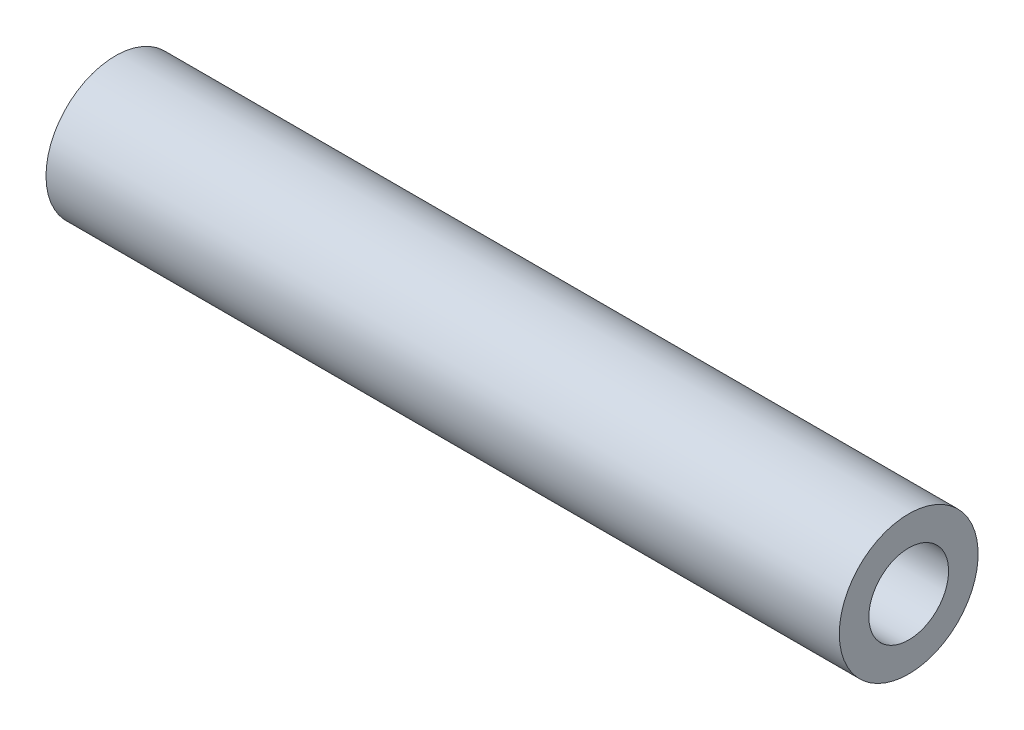
ISO-10303-21;
HEADER;
FILE_DESCRIPTION(('STEP AP214'),'2;1');
FILE_NAME('part.step','',(''),(''),'','','');
FILE_SCHEMA(('AUTOMOTIVE_DESIGN { 1 0 10303 214 1 1 1 1 }'));
ENDSEC;
DATA;
#1=APPLICATION_CONTEXT('core data for automotive mechanical design processes');
#2=APPLICATION_PROTOCOL_DEFINITION('international standard','automotive_design',2000,#1);
#3=PRODUCT_CONTEXT('',#1,'mechanical');
#4=PRODUCT('Part','Part','',(#3));
#5=PRODUCT_RELATED_PRODUCT_CATEGORY('part','',(#4));
#6=PRODUCT_DEFINITION_FORMATION('','',#4);
#7=PRODUCT_DEFINITION_CONTEXT('part definition',#1,'design');
#8=PRODUCT_DEFINITION('design','',#6,#7);
#9=PRODUCT_DEFINITION_SHAPE('','',#8);
#10=(LENGTH_UNIT() NAMED_UNIT(*) SI_UNIT(.MILLI.,.METRE.));
#11=(NAMED_UNIT(*) PLANE_ANGLE_UNIT() SI_UNIT($,.RADIAN.));
#12=(NAMED_UNIT(*) SI_UNIT($,.STERADIAN.) SOLID_ANGLE_UNIT());
#13=UNCERTAINTY_MEASURE_WITH_UNIT(LENGTH_MEASURE(1.E-05),#10,'distance_accuracy_value','');
#14=(GEOMETRIC_REPRESENTATION_CONTEXT(3) GLOBAL_UNCERTAINTY_ASSIGNED_CONTEXT((#13)) GLOBAL_UNIT_ASSIGNED_CONTEXT((#10,
#11,#12)) REPRESENTATION_CONTEXT('',''));
#15=CARTESIAN_POINT('',(0.,0.,0.));
#16=DIRECTION('',(0.,0.,1.));
#17=DIRECTION('',(1.,0.,0.));
#18=AXIS2_PLACEMENT_3D('',#15,#16,#17);
#19=CARTESIAN_POINT('',(25.4,0.,0.));
#20=DIRECTION('',(1.,0.,0.));
#21=DIRECTION('',(0.,0.,1.));
#22=AXIS2_PLACEMENT_3D('',#19,#20,#21);
#23=PLANE('',#22);
#24=CARTESIAN_POINT('',(25.4,0.,0.));
#25=DIRECTION('',(-1.,0.,0.));
#26=DIRECTION('',(0.,0.,1.));
#27=AXIS2_PLACEMENT_3D('',#24,#25,#26);
#28=CIRCLE('',#27,4.445);
#29=CARTESIAN_POINT('',(25.4,0.,4.445));
#30=VERTEX_POINT('',#29);
#31=EDGE_CURVE('E10',#30,#30,#28,.T.);
#32=ORIENTED_EDGE('',*,*,#31,.F.);
#33=EDGE_LOOP('',(#32));
#34=FACE_BOUND('',#33,.T.);
#35=CARTESIAN_POINT('',(25.4,0.,0.));
#36=DIRECTION('',(-1.,0.,0.));
#37=DIRECTION('',(0.,0.,1.));
#38=AXIS2_PLACEMENT_3D('',#35,#36,#37);
#39=CIRCLE('',#38,2.5527);
#40=CARTESIAN_POINT('',(25.4,0.,2.5527));
#41=VERTEX_POINT('',#40);
#42=EDGE_CURVE('E46',#41,#41,#39,.T.);
#43=ORIENTED_EDGE('',*,*,#42,.T.);
#44=EDGE_LOOP('',(#43));
#45=FACE_BOUND('',#44,.T.);
#46=ADVANCED_FACE('F35',(#34,#45),#23,.T.);
#47=CARTESIAN_POINT('',(-25.4,0.,0.));
#48=DIRECTION('',(1.,0.,0.));
#49=DIRECTION('',(0.,0.,1.));
#50=AXIS2_PLACEMENT_3D('',#47,#48,#49);
#51=PLANE('',#50);
#52=CARTESIAN_POINT('',(-25.4,0.,0.));
#53=DIRECTION('',(-1.,0.,0.));
#54=DIRECTION('',(0.,0.,1.));
#55=AXIS2_PLACEMENT_3D('',#52,#53,#54);
#56=CIRCLE('',#55,4.445);
#57=CARTESIAN_POINT('',(-25.4,0.,4.445));
#58=VERTEX_POINT('',#57);
#59=EDGE_CURVE('E39',#58,#58,#56,.T.);
#60=ORIENTED_EDGE('',*,*,#59,.T.);
#61=EDGE_LOOP('',(#60));
#62=FACE_BOUND('',#61,.T.);
#63=CARTESIAN_POINT('',(-25.4,0.,0.));
#64=DIRECTION('',(-1.,0.,0.));
#65=DIRECTION('',(0.,0.,1.));
#66=AXIS2_PLACEMENT_3D('',#63,#64,#65);
#67=CIRCLE('',#66,2.5527);
#68=CARTESIAN_POINT('',(-25.4,0.,2.5527));
#69=VERTEX_POINT('',#68);
#70=EDGE_CURVE('E48',#69,#69,#67,.T.);
#71=ORIENTED_EDGE('',*,*,#70,.F.);
#72=EDGE_LOOP('',(#71));
#73=FACE_BOUND('',#72,.T.);
#74=ADVANCED_FACE('F61',(#62,#73),#51,.F.);
#75=CARTESIAN_POINT('',(25.4,0.,0.));
#76=DIRECTION('',(-1.,0.,0.));
#77=DIRECTION('',(0.,0.,-1.));
#78=AXIS2_PLACEMENT_3D('',#75,#76,#77);
#79=CYLINDRICAL_SURFACE('',#78,4.445);
#80=ORIENTED_EDGE('',*,*,#31,.T.);
#81=EDGE_LOOP('',(#80));
#82=FACE_BOUND('',#81,.T.);
#83=ORIENTED_EDGE('',*,*,#59,.F.);
#84=EDGE_LOOP('',(#83));
#85=FACE_BOUND('',#84,.T.);
#86=ADVANCED_FACE('F37',(#82,#85),#79,.T.);
#87=CARTESIAN_POINT('',(25.4,0.,0.));
#88=DIRECTION('',(-1.,0.,0.));
#89=DIRECTION('',(0.,0.,-1.));
#90=AXIS2_PLACEMENT_3D('',#87,#88,#89);
#91=CYLINDRICAL_SURFACE('',#90,2.5527);
#92=ORIENTED_EDGE('',*,*,#42,.F.);
#93=EDGE_LOOP('',(#92));
#94=FACE_BOUND('',#93,.T.);
#95=ORIENTED_EDGE('',*,*,#70,.T.);
#96=EDGE_LOOP('',(#95));
#97=FACE_BOUND('',#96,.T.);
#98=ADVANCED_FACE('F55',(#94,#97),#91,.F.);
#99=CLOSED_SHELL('',(#46,#74,#86,#98));
#100=MANIFOLD_SOLID_BREP('B2',#99);
#101=ADVANCED_BREP_SHAPE_REPRESENTATION('',(#18,#100),#14);
#102=SHAPE_DEFINITION_REPRESENTATION(#9,#101);
ENDSEC;
END-ISO-10303-21;
